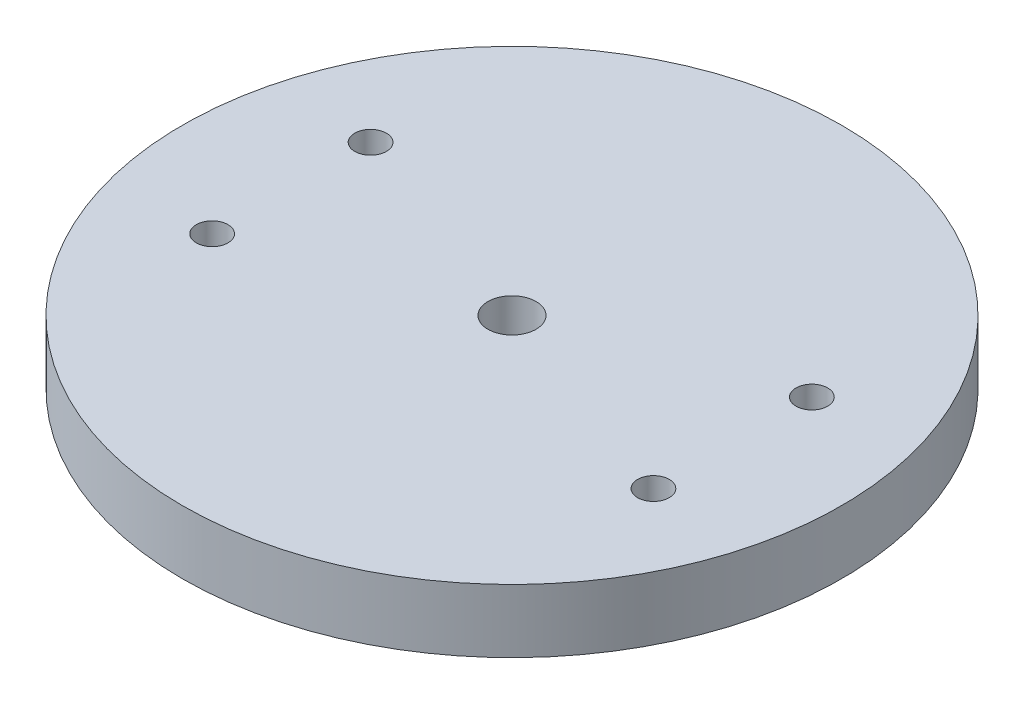
ISO-10303-21;
HEADER;
FILE_DESCRIPTION(('STEP AP214'),'2;1');
FILE_NAME('part.step','',(''),(''),'','','');
FILE_SCHEMA(('AUTOMOTIVE_DESIGN { 1 0 10303 214 1 1 1 1 }'));
ENDSEC;
DATA;
#1=APPLICATION_CONTEXT('core data for automotive mechanical design processes');
#2=APPLICATION_PROTOCOL_DEFINITION('international standard','automotive_design',2000,#1);
#3=PRODUCT_CONTEXT('',#1,'mechanical');
#4=PRODUCT('Part','Part','',(#3));
#5=PRODUCT_RELATED_PRODUCT_CATEGORY('part','',(#4));
#6=PRODUCT_DEFINITION_FORMATION('','',#4);
#7=PRODUCT_DEFINITION_CONTEXT('part definition',#1,'design');
#8=PRODUCT_DEFINITION('design','',#6,#7);
#9=PRODUCT_DEFINITION_SHAPE('','',#8);
#10=(LENGTH_UNIT() NAMED_UNIT(*) SI_UNIT(.MILLI.,.METRE.));
#11=(NAMED_UNIT(*) PLANE_ANGLE_UNIT() SI_UNIT($,.RADIAN.));
#12=(NAMED_UNIT(*) SI_UNIT($,.STERADIAN.) SOLID_ANGLE_UNIT());
#13=UNCERTAINTY_MEASURE_WITH_UNIT(LENGTH_MEASURE(1.E-05),#10,'distance_accuracy_value','');
#14=(GEOMETRIC_REPRESENTATION_CONTEXT(3) GLOBAL_UNCERTAINTY_ASSIGNED_CONTEXT((#13)) GLOBAL_UNIT_ASSIGNED_CONTEXT((#10,
#11,#12)) REPRESENTATION_CONTEXT('',''));
#15=CARTESIAN_POINT('',(0.,0.,0.));
#16=DIRECTION('',(0.,0.,1.));
#17=DIRECTION('',(1.,0.,0.));
#18=AXIS2_PLACEMENT_3D('',#15,#16,#17);
#19=CARTESIAN_POINT('',(0.,12.7,0.));
#20=DIRECTION('',(0.,-1.,0.));
#21=DIRECTION('',(0.,0.,-1.));
#22=AXIS2_PLACEMENT_3D('',#19,#20,#21);
#23=CYLINDRICAL_SURFACE('',#22,66.04);
#24=CARTESIAN_POINT('',(0.,12.7,0.));
#25=DIRECTION('',(0.,1.,0.));
#26=DIRECTION('',(0.,0.,1.));
#27=AXIS2_PLACEMENT_3D('',#24,#25,#26);
#28=CIRCLE('',#27,66.04);
#29=CARTESIAN_POINT('',(0.,12.7,66.04));
#30=VERTEX_POINT('',#29);
#31=EDGE_CURVE('E10',#30,#30,#28,.T.);
#32=ORIENTED_EDGE('',*,*,#31,.F.);
#33=EDGE_LOOP('',(#32));
#34=FACE_BOUND('',#33,.T.);
#35=CARTESIAN_POINT('',(0.,0.,0.));
#36=DIRECTION('',(0.,1.,0.));
#37=DIRECTION('',(0.,0.,1.));
#38=AXIS2_PLACEMENT_3D('',#35,#36,#37);
#39=CIRCLE('',#38,66.04);
#40=CARTESIAN_POINT('',(0.,0.,66.04));
#41=VERTEX_POINT('',#40);
#42=EDGE_CURVE('E33',#41,#41,#39,.T.);
#43=ORIENTED_EDGE('',*,*,#42,.T.);
#44=EDGE_LOOP('',(#43));
#45=FACE_BOUND('',#44,.T.);
#46=ADVANCED_FACE('F30',(#34,#45),#23,.T.);
#47=CARTESIAN_POINT('',(0.,12.7,0.));
#48=DIRECTION('',(0.,1.,0.));
#49=DIRECTION('',(0.,0.,1.));
#50=AXIS2_PLACEMENT_3D('',#47,#48,#49);
#51=PLANE('',#50);
#52=CARTESIAN_POINT('',(0.,12.7,0.));
#53=DIRECTION('',(0.,-1.,0.));
#54=DIRECTION('',(0.,0.,-1.));
#55=AXIS2_PLACEMENT_3D('',#52,#53,#54);
#56=CIRCLE('',#55,4.826);
#57=CARTESIAN_POINT('',(0.,12.7,-4.826));
#58=VERTEX_POINT('',#57);
#59=EDGE_CURVE('E61',#58,#58,#56,.T.);
#60=ORIENTED_EDGE('',*,*,#59,.T.);
#61=EDGE_LOOP('',(#60));
#62=FACE_BOUND('',#61,.T.);
#63=CARTESIAN_POINT('',(44.2148136214073,12.7,-15.875));
#64=DIRECTION('',(0.,1.,0.));
#65=DIRECTION('',(0.,0.,1.));
#66=AXIS2_PLACEMENT_3D('',#63,#64,#65);
#67=CIRCLE('',#66,3.175);
#68=CARTESIAN_POINT('',(44.2148136214073,12.7,-12.7));
#69=VERTEX_POINT('',#68);
#70=EDGE_CURVE('E40',#69,#69,#67,.T.);
#71=ORIENTED_EDGE('',*,*,#70,.F.);
#72=EDGE_LOOP('',(#71));
#73=FACE_BOUND('',#72,.T.);
#74=CARTESIAN_POINT('',(44.2148136214073,12.7,15.8749999999999));
#75=DIRECTION('',(0.,1.,0.));
#76=DIRECTION('',(0.,0.,1.));
#77=AXIS2_PLACEMENT_3D('',#74,#75,#76);
#78=CIRCLE('',#77,3.175);
#79=CARTESIAN_POINT('',(44.2148136214073,12.7,19.0499999999999));
#80=VERTEX_POINT('',#79);
#81=EDGE_CURVE('E44',#80,#80,#78,.T.);
#82=ORIENTED_EDGE('',*,*,#81,.F.);
#83=EDGE_LOOP('',(#82));
#84=FACE_BOUND('',#83,.T.);
#85=CARTESIAN_POINT('',(-44.2148136214073,12.7,15.875));
#86=DIRECTION('',(0.,1.,0.));
#87=DIRECTION('',(0.,0.,1.));
#88=AXIS2_PLACEMENT_3D('',#85,#86,#87);
#89=CIRCLE('',#88,3.175);
#90=CARTESIAN_POINT('',(-44.2148136214073,12.7,19.05));
#91=VERTEX_POINT('',#90);
#92=EDGE_CURVE('E47',#91,#91,#89,.T.);
#93=ORIENTED_EDGE('',*,*,#92,.F.);
#94=EDGE_LOOP('',(#93));
#95=FACE_BOUND('',#94,.T.);
#96=CARTESIAN_POINT('',(-44.2148136214073,12.7,-15.875));
#97=DIRECTION('',(0.,1.,0.));
#98=DIRECTION('',(0.,0.,1.));
#99=AXIS2_PLACEMENT_3D('',#96,#97,#98);
#100=CIRCLE('',#99,3.175);
#101=CARTESIAN_POINT('',(-44.2148136214073,12.7,-12.7));
#102=VERTEX_POINT('',#101);
#103=EDGE_CURVE('E50',#102,#102,#100,.T.);
#104=ORIENTED_EDGE('',*,*,#103,.F.);
#105=EDGE_LOOP('',(#104));
#106=FACE_BOUND('',#105,.T.);
#107=ORIENTED_EDGE('',*,*,#31,.T.);
#108=EDGE_LOOP('',(#107));
#109=FACE_BOUND('',#108,.T.);
#110=ADVANCED_FACE('F72',(#62,#73,#84,#95,#106,#109),#51,.T.);
#111=CARTESIAN_POINT('',(0.,0.,0.));
#112=DIRECTION('',(0.,1.,0.));
#113=DIRECTION('',(0.,0.,1.));
#114=AXIS2_PLACEMENT_3D('',#111,#112,#113);
#115=PLANE('',#114);
#116=CARTESIAN_POINT('',(0.,0.,0.));
#117=DIRECTION('',(0.,-1.,0.));
#118=DIRECTION('',(0.,0.,-1.));
#119=AXIS2_PLACEMENT_3D('',#116,#117,#118);
#120=CIRCLE('',#119,4.826);
#121=CARTESIAN_POINT('',(0.,0.,-4.826));
#122=VERTEX_POINT('',#121);
#123=EDGE_CURVE('E66',#122,#122,#120,.T.);
#124=ORIENTED_EDGE('',*,*,#123,.F.);
#125=EDGE_LOOP('',(#124));
#126=FACE_BOUND('',#125,.T.);
#127=CARTESIAN_POINT('',(44.2148136214073,0.,-15.875));
#128=DIRECTION('',(0.,1.,0.));
#129=DIRECTION('',(0.,0.,-1.));
#130=AXIS2_PLACEMENT_3D('',#127,#128,#129);
#131=CIRCLE('',#130,3.175);
#132=CARTESIAN_POINT('',(44.2148136214073,0.,-19.05));
#133=VERTEX_POINT('',#132);
#134=EDGE_CURVE('E57',#133,#133,#131,.T.);
#135=ORIENTED_EDGE('',*,*,#134,.T.);
#136=EDGE_LOOP('',(#135));
#137=FACE_BOUND('',#136,.T.);
#138=CARTESIAN_POINT('',(44.2148136214073,0.,15.8749999999999));
#139=DIRECTION('',(0.,1.,0.));
#140=DIRECTION('',(0.,0.,1.));
#141=AXIS2_PLACEMENT_3D('',#138,#139,#140);
#142=CIRCLE('',#141,3.175);
#143=CARTESIAN_POINT('',(44.2148136214073,0.,19.0499999999999));
#144=VERTEX_POINT('',#143);
#145=EDGE_CURVE('E60',#144,#144,#142,.T.);
#146=ORIENTED_EDGE('',*,*,#145,.T.);
#147=EDGE_LOOP('',(#146));
#148=FACE_BOUND('',#147,.T.);
#149=CARTESIAN_POINT('',(-44.2148136214073,0.,15.875));
#150=DIRECTION('',(0.,1.,0.));
#151=DIRECTION('',(0.,0.,-1.));
#152=AXIS2_PLACEMENT_3D('',#149,#150,#151);
#153=CIRCLE('',#152,3.175);
#154=CARTESIAN_POINT('',(-44.2148136214073,0.,12.7));
#155=VERTEX_POINT('',#154);
#156=EDGE_CURVE('E56',#155,#155,#153,.T.);
#157=ORIENTED_EDGE('',*,*,#156,.T.);
#158=EDGE_LOOP('',(#157));
#159=FACE_BOUND('',#158,.T.);
#160=CARTESIAN_POINT('',(-44.2148136214073,0.,-15.875));
#161=DIRECTION('',(0.,1.,0.));
#162=DIRECTION('',(0.,0.,1.));
#163=AXIS2_PLACEMENT_3D('',#160,#161,#162);
#164=CIRCLE('',#163,3.175);
#165=CARTESIAN_POINT('',(-44.2148136214073,0.,-12.7));
#166=VERTEX_POINT('',#165);
#167=EDGE_CURVE('E53',#166,#166,#164,.T.);
#168=ORIENTED_EDGE('',*,*,#167,.T.);
#169=EDGE_LOOP('',(#168));
#170=FACE_BOUND('',#169,.T.);
#171=ORIENTED_EDGE('',*,*,#42,.F.);
#172=EDGE_LOOP('',(#171));
#173=FACE_BOUND('',#172,.T.);
#174=ADVANCED_FACE('F82',(#126,#137,#148,#159,#170,#173),#115,.F.);
#175=CARTESIAN_POINT('',(-44.2148136214073,0.,-15.875));
#176=DIRECTION('',(0.,1.,0.));
#177=DIRECTION('',(0.,0.,1.));
#178=AXIS2_PLACEMENT_3D('',#175,#176,#177);
#179=CYLINDRICAL_SURFACE('',#178,3.175);
#180=ORIENTED_EDGE('',*,*,#103,.T.);
#181=EDGE_LOOP('',(#180));
#182=FACE_BOUND('',#181,.T.);
#183=ORIENTED_EDGE('',*,*,#167,.F.);
#184=EDGE_LOOP('',(#183));
#185=FACE_BOUND('',#184,.T.);
#186=ADVANCED_FACE('F85',(#182,#185),#179,.F.);
#187=CARTESIAN_POINT('',(-44.2148136214073,0.,15.875));
#188=DIRECTION('',(0.,1.,0.));
#189=DIRECTION('',(0.,0.,1.));
#190=AXIS2_PLACEMENT_3D('',#187,#188,#189);
#191=CYLINDRICAL_SURFACE('',#190,3.175);
#192=ORIENTED_EDGE('',*,*,#92,.T.);
#193=EDGE_LOOP('',(#192));
#194=FACE_BOUND('',#193,.T.);
#195=ORIENTED_EDGE('',*,*,#156,.F.);
#196=EDGE_LOOP('',(#195));
#197=FACE_BOUND('',#196,.T.);
#198=ADVANCED_FACE('F107',(#194,#197),#191,.F.);
#199=CARTESIAN_POINT('',(44.2148136214073,0.,15.8749999999999));
#200=DIRECTION('',(0.,1.,0.));
#201=DIRECTION('',(0.,0.,1.));
#202=AXIS2_PLACEMENT_3D('',#199,#200,#201);
#203=CYLINDRICAL_SURFACE('',#202,3.175);
#204=ORIENTED_EDGE('',*,*,#81,.T.);
#205=EDGE_LOOP('',(#204));
#206=FACE_BOUND('',#205,.T.);
#207=ORIENTED_EDGE('',*,*,#145,.F.);
#208=EDGE_LOOP('',(#207));
#209=FACE_BOUND('',#208,.T.);
#210=ADVANCED_FACE('F111',(#206,#209),#203,.F.);
#211=CARTESIAN_POINT('',(44.2148136214073,0.,-15.875));
#212=DIRECTION('',(0.,1.,0.));
#213=DIRECTION('',(0.,0.,1.));
#214=AXIS2_PLACEMENT_3D('',#211,#212,#213);
#215=CYLINDRICAL_SURFACE('',#214,3.175);
#216=ORIENTED_EDGE('',*,*,#70,.T.);
#217=EDGE_LOOP('',(#216));
#218=FACE_BOUND('',#217,.T.);
#219=ORIENTED_EDGE('',*,*,#134,.F.);
#220=EDGE_LOOP('',(#219));
#221=FACE_BOUND('',#220,.T.);
#222=ADVANCED_FACE('F78',(#218,#221),#215,.F.);
#223=CARTESIAN_POINT('',(0.,12.7,0.));
#224=DIRECTION('',(0.,-1.,0.));
#225=DIRECTION('',(0.,0.,-1.));
#226=AXIS2_PLACEMENT_3D('',#223,#224,#225);
#227=CYLINDRICAL_SURFACE('',#226,4.826);
#228=ORIENTED_EDGE('',*,*,#59,.F.);
#229=EDGE_LOOP('',(#228));
#230=FACE_BOUND('',#229,.T.);
#231=ORIENTED_EDGE('',*,*,#123,.T.);
#232=EDGE_LOOP('',(#231));
#233=FACE_BOUND('',#232,.T.);
#234=ADVANCED_FACE('F75',(#230,#233),#227,.F.);
#235=CLOSED_SHELL('',(#46,#110,#174,#186,#198,#210,#222,#234));
#236=MANIFOLD_SOLID_BREP('B2',#235);
#237=ADVANCED_BREP_SHAPE_REPRESENTATION('',(#18,#236),#14);
#238=SHAPE_DEFINITION_REPRESENTATION(#9,#237);
ENDSEC;
END-ISO-10303-21;
